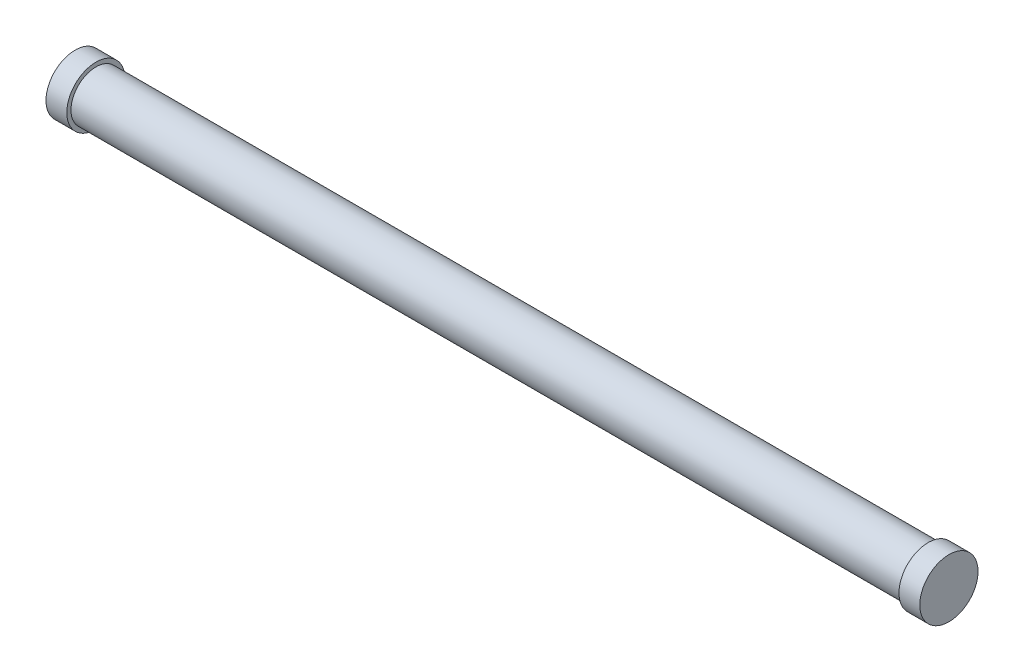
ISO-10303-21;
HEADER;
FILE_DESCRIPTION(('STEP AP214'),'2;1');
FILE_NAME('part.step','',(''),(''),'','','');
FILE_SCHEMA(('AUTOMOTIVE_DESIGN { 1 0 10303 214 1 1 1 1 }'));
ENDSEC;
DATA;
#1=APPLICATION_CONTEXT('core data for automotive mechanical design processes');
#2=APPLICATION_PROTOCOL_DEFINITION('international standard','automotive_design',2000,#1);
#3=PRODUCT_CONTEXT('',#1,'mechanical');
#4=PRODUCT('Part','Part','',(#3));
#5=PRODUCT_RELATED_PRODUCT_CATEGORY('part','',(#4));
#6=PRODUCT_DEFINITION_FORMATION('','',#4);
#7=PRODUCT_DEFINITION_CONTEXT('part definition',#1,'design');
#8=PRODUCT_DEFINITION('design','',#6,#7);
#9=PRODUCT_DEFINITION_SHAPE('','',#8);
#10=(LENGTH_UNIT() NAMED_UNIT(*) SI_UNIT(.MILLI.,.METRE.));
#11=(NAMED_UNIT(*) PLANE_ANGLE_UNIT() SI_UNIT($,.RADIAN.));
#12=(NAMED_UNIT(*) SI_UNIT($,.STERADIAN.) SOLID_ANGLE_UNIT());
#13=UNCERTAINTY_MEASURE_WITH_UNIT(LENGTH_MEASURE(1.E-05),#10,'distance_accuracy_value','');
#14=(GEOMETRIC_REPRESENTATION_CONTEXT(3) GLOBAL_UNCERTAINTY_ASSIGNED_CONTEXT((#13)) GLOBAL_UNIT_ASSIGNED_CONTEXT((#10,
#11,#12)) REPRESENTATION_CONTEXT('',''));
#15=CARTESIAN_POINT('',(0.,0.,0.));
#16=DIRECTION('',(0.,0.,1.));
#17=DIRECTION('',(1.,0.,0.));
#18=AXIS2_PLACEMENT_3D('',#15,#16,#17);
#19=CARTESIAN_POINT('',(-34.7204610951009,0.,-5.99999999999997));
#20=DIRECTION('',(-1.,0.,0.));
#21=DIRECTION('',(0.,0.,1.));
#22=AXIS2_PLACEMENT_3D('',#19,#20,#21);
#23=CYLINDRICAL_SURFACE('',#22,6.00000000000003);
#24=CARTESIAN_POINT('',(-34.7204610951009,0.,-5.99999999999997));
#25=DIRECTION('',(-1.,0.,0.));
#26=DIRECTION('',(0.,0.,1.));
#27=AXIS2_PLACEMENT_3D('',#24,#25,#26);
#28=CIRCLE('',#27,6.00000000000003);
#29=CARTESIAN_POINT('',(-34.7204610951009,0.,0.));
#30=VERTEX_POINT('',#29);
#31=EDGE_CURVE('E10',#30,#30,#28,.T.);
#32=ORIENTED_EDGE('',*,*,#31,.F.);
#33=EDGE_LOOP('',(#32));
#34=FACE_BOUND('',#33,.T.);
#35=CARTESIAN_POINT('',(165.279538904899,0.,-5.99999999999997));
#36=DIRECTION('',(-1.,0.,0.));
#37=DIRECTION('',(0.,0.,1.));
#38=AXIS2_PLACEMENT_3D('',#35,#36,#37);
#39=CIRCLE('',#38,6.00000000000002);
#40=CARTESIAN_POINT('',(165.279538904899,0.,0.));
#41=VERTEX_POINT('',#40);
#42=EDGE_CURVE('E34',#41,#41,#39,.T.);
#43=ORIENTED_EDGE('',*,*,#42,.T.);
#44=EDGE_LOOP('',(#43));
#45=FACE_BOUND('',#44,.T.);
#46=ADVANCED_FACE('F31',(#34,#45),#23,.T.);
#47=CARTESIAN_POINT('',(-39.7204610951009,0.,-5.99999999999997));
#48=DIRECTION('',(1.,0.,0.));
#49=DIRECTION('',(0.,0.,-1.));
#50=AXIS2_PLACEMENT_3D('',#47,#48,#49);
#51=CYLINDRICAL_SURFACE('',#50,7.);
#52=CARTESIAN_POINT('',(-39.7204610951009,0.,-5.99999999999997));
#53=DIRECTION('',(-1.,0.,0.));
#54=DIRECTION('',(0.,0.,1.));
#55=AXIS2_PLACEMENT_3D('',#52,#53,#54);
#56=CIRCLE('',#55,7.);
#57=CARTESIAN_POINT('',(-39.7204610951009,0.,1.00000000000003));
#58=VERTEX_POINT('',#57);
#59=EDGE_CURVE('E38',#58,#58,#56,.T.);
#60=ORIENTED_EDGE('',*,*,#59,.F.);
#61=EDGE_LOOP('',(#60));
#62=FACE_BOUND('',#61,.T.);
#63=CARTESIAN_POINT('',(-34.7204610951009,0.,-5.99999999999997));
#64=DIRECTION('',(-1.,0.,0.));
#65=DIRECTION('',(0.,0.,1.));
#66=AXIS2_PLACEMENT_3D('',#63,#64,#65);
#67=CIRCLE('',#66,7.);
#68=CARTESIAN_POINT('',(-34.7204610951009,0.,1.00000000000003));
#69=VERTEX_POINT('',#68);
#70=EDGE_CURVE('E42',#69,#69,#67,.T.);
#71=ORIENTED_EDGE('',*,*,#70,.T.);
#72=EDGE_LOOP('',(#71));
#73=FACE_BOUND('',#72,.T.);
#74=ADVANCED_FACE('F79',(#62,#73),#51,.T.);
#75=CARTESIAN_POINT('',(-39.7204610951009,0.,-5.99999999999997));
#76=DIRECTION('',(-1.,0.,0.));
#77=DIRECTION('',(0.,0.,1.));
#78=AXIS2_PLACEMENT_3D('',#75,#76,#77);
#79=PLANE('',#78);
#80=ORIENTED_EDGE('',*,*,#59,.T.);
#81=EDGE_LOOP('',(#80));
#82=FACE_BOUND('',#81,.T.);
#83=ADVANCED_FACE('F75',(#82),#79,.T.);
#84=CARTESIAN_POINT('',(-34.7204610951009,0.,-5.99999999999997));
#85=DIRECTION('',(-1.,0.,0.));
#86=DIRECTION('',(0.,0.,1.));
#87=AXIS2_PLACEMENT_3D('',#84,#85,#86);
#88=PLANE('',#87);
#89=ORIENTED_EDGE('',*,*,#31,.T.);
#90=EDGE_LOOP('',(#89));
#91=FACE_BOUND('',#90,.T.);
#92=ORIENTED_EDGE('',*,*,#70,.F.);
#93=EDGE_LOOP('',(#92));
#94=FACE_BOUND('',#93,.T.);
#95=ADVANCED_FACE('F67',(#91,#94),#88,.F.);
#96=CARTESIAN_POINT('',(170.279538904899,0.,-5.99999999999997));
#97=DIRECTION('',(-1.,0.,0.));
#98=DIRECTION('',(0.,0.,1.));
#99=AXIS2_PLACEMENT_3D('',#96,#97,#98);
#100=CYLINDRICAL_SURFACE('',#99,7.);
#101=CARTESIAN_POINT('',(170.279538904899,0.,-5.99999999999997));
#102=DIRECTION('',(-1.,0.,0.));
#103=DIRECTION('',(0.,0.,1.));
#104=AXIS2_PLACEMENT_3D('',#101,#102,#103);
#105=CIRCLE('',#104,7.);
#106=CARTESIAN_POINT('',(170.279538904899,0.,1.00000000000003));
#107=VERTEX_POINT('',#106);
#108=EDGE_CURVE('E50',#107,#107,#105,.T.);
#109=ORIENTED_EDGE('',*,*,#108,.T.);
#110=EDGE_LOOP('',(#109));
#111=FACE_BOUND('',#110,.T.);
#112=CARTESIAN_POINT('',(165.279538904899,0.,-5.99999999999997));
#113=DIRECTION('',(-1.,0.,0.));
#114=DIRECTION('',(0.,0.,1.));
#115=AXIS2_PLACEMENT_3D('',#112,#113,#114);
#116=CIRCLE('',#115,7.);
#117=CARTESIAN_POINT('',(165.279538904899,0.,1.00000000000003));
#118=VERTEX_POINT('',#117);
#119=EDGE_CURVE('E47',#118,#118,#116,.T.);
#120=ORIENTED_EDGE('',*,*,#119,.F.);
#121=EDGE_LOOP('',(#120));
#122=FACE_BOUND('',#121,.T.);
#123=ADVANCED_FACE('F65',(#111,#122),#100,.T.);
#124=CARTESIAN_POINT('',(170.279538904899,0.,-5.99999999999997));
#125=DIRECTION('',(1.,0.,0.));
#126=DIRECTION('',(0.,0.,1.));
#127=AXIS2_PLACEMENT_3D('',#124,#125,#126);
#128=PLANE('',#127);
#129=ORIENTED_EDGE('',*,*,#108,.F.);
#130=EDGE_LOOP('',(#129));
#131=FACE_BOUND('',#130,.T.);
#132=ADVANCED_FACE('F61',(#131),#128,.T.);
#133=CARTESIAN_POINT('',(165.279538904899,0.,-5.99999999999997));
#134=DIRECTION('',(1.,0.,0.));
#135=DIRECTION('',(0.,0.,1.));
#136=AXIS2_PLACEMENT_3D('',#133,#134,#135);
#137=PLANE('',#136);
#138=ORIENTED_EDGE('',*,*,#42,.F.);
#139=EDGE_LOOP('',(#138));
#140=FACE_BOUND('',#139,.T.);
#141=ORIENTED_EDGE('',*,*,#119,.T.);
#142=EDGE_LOOP('',(#141));
#143=FACE_BOUND('',#142,.T.);
#144=ADVANCED_FACE('F58',(#140,#143),#137,.F.);
#145=CLOSED_SHELL('',(#46,#74,#83,#95,#123,#132,#144));
#146=MANIFOLD_SOLID_BREP('B2',#145);
#147=ADVANCED_BREP_SHAPE_REPRESENTATION('',(#18,#146),#14);
#148=SHAPE_DEFINITION_REPRESENTATION(#9,#147);
ENDSEC;
END-ISO-10303-21;
